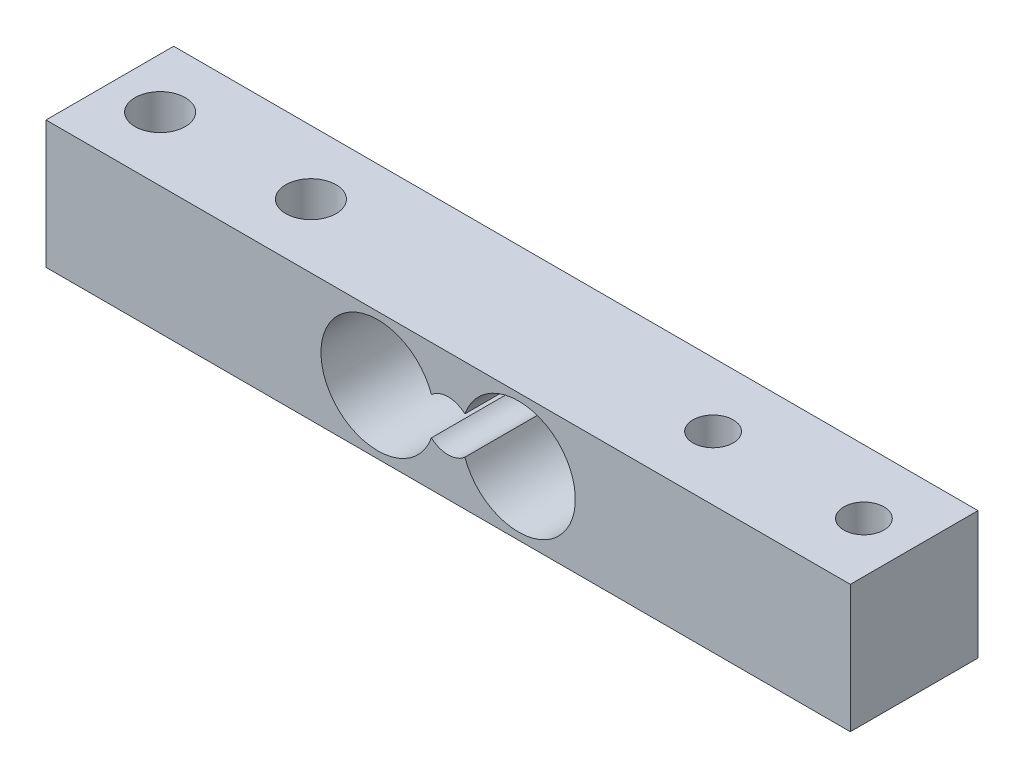
ISO-10303-21;
HEADER;
FILE_DESCRIPTION(('STEP AP214'),'2;1');
FILE_NAME('part.step','',(''),(''),'','','');
FILE_SCHEMA(('AUTOMOTIVE_DESIGN { 1 0 10303 214 1 1 1 1 }'));
ENDSEC;
DATA;
#1=APPLICATION_CONTEXT('core data for automotive mechanical design processes');
#2=APPLICATION_PROTOCOL_DEFINITION('international standard','automotive_design',2000,#1);
#3=PRODUCT_CONTEXT('',#1,'mechanical');
#4=PRODUCT('Part','Part','',(#3));
#5=PRODUCT_RELATED_PRODUCT_CATEGORY('part','',(#4));
#6=PRODUCT_DEFINITION_FORMATION('','',#4);
#7=PRODUCT_DEFINITION_CONTEXT('part definition',#1,'design');
#8=PRODUCT_DEFINITION('design','',#6,#7);
#9=PRODUCT_DEFINITION_SHAPE('','',#8);
#10=(LENGTH_UNIT() NAMED_UNIT(*) SI_UNIT(.MILLI.,.METRE.));
#11=(NAMED_UNIT(*) PLANE_ANGLE_UNIT() SI_UNIT($,.RADIAN.));
#12=(NAMED_UNIT(*) SI_UNIT($,.STERADIAN.) SOLID_ANGLE_UNIT());
#13=UNCERTAINTY_MEASURE_WITH_UNIT(LENGTH_MEASURE(1.E-05),#10,'distance_accuracy_value','');
#14=(GEOMETRIC_REPRESENTATION_CONTEXT(3) GLOBAL_UNCERTAINTY_ASSIGNED_CONTEXT((#13)) GLOBAL_UNIT_ASSIGNED_CONTEXT((#10,
#11,#12)) REPRESENTATION_CONTEXT('',''));
#15=CARTESIAN_POINT('',(0.,0.,0.));
#16=DIRECTION('',(0.,0.,1.));
#17=DIRECTION('',(1.,0.,0.));
#18=AXIS2_PLACEMENT_3D('',#15,#16,#17);
#19=CARTESIAN_POINT('',(0.,12.7,0.));
#20=DIRECTION('',(0.,-1.,0.));
#21=DIRECTION('',(0.,0.,-1.));
#22=AXIS2_PLACEMENT_3D('',#19,#20,#21);
#23=PLANE('',#22);
#24=DIRECTION('',(0.,0.,-1.));
#25=VECTOR('',#24,1.);
#26=CARTESIAN_POINT('',(40.,12.7,6.35));
#27=LINE('',#26,#25);
#28=CARTESIAN_POINT('',(40.,12.7,6.35));
#29=VERTEX_POINT('',#28);
#30=CARTESIAN_POINT('',(40.,12.7,-6.35));
#31=VERTEX_POINT('',#30);
#32=EDGE_CURVE('E158',#29,#31,#27,.T.);
#33=ORIENTED_EDGE('',*,*,#32,.T.);
#34=DIRECTION('',(-1.,0.,0.));
#35=VECTOR('',#34,1.);
#36=CARTESIAN_POINT('',(-40.,12.7,-6.35));
#37=LINE('',#36,#35);
#38=CARTESIAN_POINT('',(-40.,12.7,-6.35));
#39=VERTEX_POINT('',#38);
#40=EDGE_CURVE('E161',#31,#39,#37,.T.);
#41=ORIENTED_EDGE('',*,*,#40,.T.);
#42=DIRECTION('',(0.,0.,1.));
#43=VECTOR('',#42,1.);
#44=CARTESIAN_POINT('',(-40.,12.7,6.35));
#45=LINE('',#44,#43);
#46=CARTESIAN_POINT('',(-40.,12.7,6.35));
#47=VERTEX_POINT('',#46);
#48=EDGE_CURVE('E164',#39,#47,#45,.T.);
#49=ORIENTED_EDGE('',*,*,#48,.T.);
#50=DIRECTION('',(1.,0.,0.));
#51=VECTOR('',#50,1.);
#52=CARTESIAN_POINT('',(-40.,12.7,6.35));
#53=LINE('',#52,#51);
#54=EDGE_CURVE('E166',#47,#29,#53,.T.);
#55=ORIENTED_EDGE('',*,*,#54,.T.);
#56=EDGE_LOOP('',(#33,#41,#49,#55));
#57=FACE_BOUND('',#56,.T.);
#58=CARTESIAN_POINT('',(-35.,12.7,0.));
#59=DIRECTION('',(0.,1.,0.));
#60=DIRECTION('',(0.,0.,1.));
#61=AXIS2_PLACEMENT_3D('',#58,#59,#60);
#62=CIRCLE('',#61,2.5);
#63=CARTESIAN_POINT('',(-35.,12.7,2.5));
#64=VERTEX_POINT('',#63);
#65=EDGE_CURVE('E152',#64,#64,#62,.T.);
#66=ORIENTED_EDGE('',*,*,#65,.F.);
#67=EDGE_LOOP('',(#66));
#68=FACE_BOUND('',#67,.T.);
#69=CARTESIAN_POINT('',(-20.,12.7,0.));
#70=DIRECTION('',(0.,1.,0.));
#71=DIRECTION('',(0.,0.,1.));
#72=AXIS2_PLACEMENT_3D('',#69,#70,#71);
#73=CIRCLE('',#72,2.5);
#74=CARTESIAN_POINT('',(-20.,12.7,2.5));
#75=VERTEX_POINT('',#74);
#76=EDGE_CURVE('E146',#75,#75,#73,.T.);
#77=ORIENTED_EDGE('',*,*,#76,.F.);
#78=EDGE_LOOP('',(#77));
#79=FACE_BOUND('',#78,.T.);
#80=CARTESIAN_POINT('',(20.,12.7,0.));
#81=DIRECTION('',(0.,1.,0.));
#82=DIRECTION('',(0.,0.,1.));
#83=AXIS2_PLACEMENT_3D('',#80,#81,#82);
#84=CIRCLE('',#83,2.);
#85=CARTESIAN_POINT('',(20.,12.7,2.));
#86=VERTEX_POINT('',#85);
#87=EDGE_CURVE('E140',#86,#86,#84,.T.);
#88=ORIENTED_EDGE('',*,*,#87,.F.);
#89=EDGE_LOOP('',(#88));
#90=FACE_BOUND('',#89,.T.);
#91=CARTESIAN_POINT('',(35.,12.7,0.));
#92=DIRECTION('',(0.,1.,0.));
#93=DIRECTION('',(0.,0.,1.));
#94=AXIS2_PLACEMENT_3D('',#91,#92,#93);
#95=CIRCLE('',#94,2.);
#96=CARTESIAN_POINT('',(35.,12.7,2.));
#97=VERTEX_POINT('',#96);
#98=EDGE_CURVE('E134',#97,#97,#95,.T.);
#99=ORIENTED_EDGE('',*,*,#98,.F.);
#100=EDGE_LOOP('',(#99));
#101=FACE_BOUND('',#100,.T.);
#102=ADVANCED_FACE('F32',(#57,#68,#79,#90,#101),#23,.F.);
#103=CARTESIAN_POINT('',(0.,0.,0.));
#104=DIRECTION('',(0.,-1.,0.));
#105=DIRECTION('',(0.,0.,-1.));
#106=AXIS2_PLACEMENT_3D('',#103,#104,#105);
#107=PLANE('',#106);
#108=CARTESIAN_POINT('',(20.,0.,0.));
#109=DIRECTION('',(0.,1.,0.));
#110=DIRECTION('',(0.,0.,1.));
#111=AXIS2_PLACEMENT_3D('',#108,#109,#110);
#112=CIRCLE('',#111,2.);
#113=CARTESIAN_POINT('',(20.,0.,2.));
#114=VERTEX_POINT('',#113);
#115=EDGE_CURVE('E137',#114,#114,#112,.T.);
#116=ORIENTED_EDGE('',*,*,#115,.T.);
#117=EDGE_LOOP('',(#116));
#118=FACE_BOUND('',#117,.T.);
#119=CARTESIAN_POINT('',(-35.,0.,0.));
#120=DIRECTION('',(0.,1.,0.));
#121=DIRECTION('',(0.,0.,1.));
#122=AXIS2_PLACEMENT_3D('',#119,#120,#121);
#123=CIRCLE('',#122,2.5);
#124=CARTESIAN_POINT('',(-35.,0.,2.5));
#125=VERTEX_POINT('',#124);
#126=EDGE_CURVE('E149',#125,#125,#123,.T.);
#127=ORIENTED_EDGE('',*,*,#126,.T.);
#128=EDGE_LOOP('',(#127));
#129=FACE_BOUND('',#128,.T.);
#130=DIRECTION('',(0.,0.,-1.));
#131=VECTOR('',#130,1.);
#132=CARTESIAN_POINT('',(40.,0.,6.35));
#133=LINE('',#132,#131);
#134=CARTESIAN_POINT('',(40.,0.,6.35));
#135=VERTEX_POINT('',#134);
#136=CARTESIAN_POINT('',(40.,0.,-6.35));
#137=VERTEX_POINT('',#136);
#138=EDGE_CURVE('E155',#135,#137,#133,.T.);
#139=ORIENTED_EDGE('',*,*,#138,.F.);
#140=DIRECTION('',(1.,0.,0.));
#141=VECTOR('',#140,1.);
#142=CARTESIAN_POINT('',(-40.,0.,6.35));
#143=LINE('',#142,#141);
#144=CARTESIAN_POINT('',(-40.,0.,6.35));
#145=VERTEX_POINT('',#144);
#146=EDGE_CURVE('E162',#145,#135,#143,.T.);
#147=ORIENTED_EDGE('',*,*,#146,.F.);
#148=DIRECTION('',(0.,0.,1.));
#149=VECTOR('',#148,1.);
#150=CARTESIAN_POINT('',(-40.,0.,6.35));
#151=LINE('',#150,#149);
#152=CARTESIAN_POINT('',(-40.,0.,-6.35));
#153=VERTEX_POINT('',#152);
#154=EDGE_CURVE('E173',#153,#145,#151,.T.);
#155=ORIENTED_EDGE('',*,*,#154,.F.);
#156=DIRECTION('',(-1.,0.,0.));
#157=VECTOR('',#156,1.);
#158=CARTESIAN_POINT('',(-40.,0.,-6.35));
#159=LINE('',#158,#157);
#160=EDGE_CURVE('E171',#137,#153,#159,.T.);
#161=ORIENTED_EDGE('',*,*,#160,.F.);
#162=EDGE_LOOP('',(#139,#147,#155,#161));
#163=FACE_BOUND('',#162,.T.);
#164=CARTESIAN_POINT('',(-20.,0.,0.));
#165=DIRECTION('',(0.,1.,0.));
#166=DIRECTION('',(0.,0.,1.));
#167=AXIS2_PLACEMENT_3D('',#164,#165,#166);
#168=CIRCLE('',#167,2.5);
#169=CARTESIAN_POINT('',(-20.,0.,2.5));
#170=VERTEX_POINT('',#169);
#171=EDGE_CURVE('E143',#170,#170,#168,.T.);
#172=ORIENTED_EDGE('',*,*,#171,.T.);
#173=EDGE_LOOP('',(#172));
#174=FACE_BOUND('',#173,.T.);
#175=CARTESIAN_POINT('',(35.,0.,0.));
#176=DIRECTION('',(0.,1.,0.));
#177=DIRECTION('',(0.,0.,1.));
#178=AXIS2_PLACEMENT_3D('',#175,#176,#177);
#179=CIRCLE('',#178,2.);
#180=CARTESIAN_POINT('',(35.,0.,2.));
#181=VERTEX_POINT('',#180);
#182=EDGE_CURVE('E130',#181,#181,#179,.T.);
#183=ORIENTED_EDGE('',*,*,#182,.T.);
#184=EDGE_LOOP('',(#183));
#185=FACE_BOUND('',#184,.T.);
#186=ADVANCED_FACE('F190',(#118,#129,#163,#174,#185),#107,.T.);
#187=CARTESIAN_POINT('',(40.,12.7,6.35));
#188=DIRECTION('',(-1.,0.,0.));
#189=DIRECTION('',(0.,0.,1.));
#190=AXIS2_PLACEMENT_3D('',#187,#188,#189);
#191=PLANE('',#190);
#192=ORIENTED_EDGE('',*,*,#138,.T.);
#193=DIRECTION('',(0.,-1.,0.));
#194=VECTOR('',#193,1.);
#195=CARTESIAN_POINT('',(40.,12.7,-6.35));
#196=LINE('',#195,#194);
#197=EDGE_CURVE('E11',#31,#137,#196,.T.);
#198=ORIENTED_EDGE('',*,*,#197,.F.);
#199=ORIENTED_EDGE('',*,*,#32,.F.);
#200=DIRECTION('',(0.,-1.,0.));
#201=VECTOR('',#200,1.);
#202=CARTESIAN_POINT('',(40.,12.7,6.35));
#203=LINE('',#202,#201);
#204=EDGE_CURVE('E168',#29,#135,#203,.T.);
#205=ORIENTED_EDGE('',*,*,#204,.T.);
#206=EDGE_LOOP('',(#192,#198,#199,#205));
#207=FACE_BOUND('',#206,.T.);
#208=ADVANCED_FACE('F34',(#207),#191,.F.);
#209=CARTESIAN_POINT('',(-40.,12.7,-6.35));
#210=DIRECTION('',(0.,0.,1.));
#211=DIRECTION('',(1.,0.,0.));
#212=AXIS2_PLACEMENT_3D('',#209,#210,#211);
#213=PLANE('',#212);
#214=CARTESIAN_POINT('',(-7.,6.35,-6.35));
#215=DIRECTION('',(0.,0.,1.));
#216=DIRECTION('',(1.,0.,0.));
#217=AXIS2_PLACEMENT_3D('',#214,#215,#216);
#218=CIRCLE('',#217,5.65);
#219=CARTESIAN_POINT('',(-1.66625,8.21376257541029,-6.35));
#220=VERTEX_POINT('',#219);
#221=CARTESIAN_POINT('',(-1.66625,4.4862374245897,-6.35));
#222=VERTEX_POINT('',#221);
#223=EDGE_CURVE('E105',#220,#222,#218,.T.);
#224=ORIENTED_EDGE('',*,*,#223,.T.);
#225=CARTESIAN_POINT('',(0.,6.35,-6.35));
#226=DIRECTION('',(0.,0.,1.));
#227=DIRECTION('',(1.,0.,0.));
#228=AXIS2_PLACEMENT_3D('',#225,#226,#227);
#229=CIRCLE('',#228,2.5);
#230=CARTESIAN_POINT('',(1.66625,4.48623742458971,-6.35));
#231=VERTEX_POINT('',#230);
#232=EDGE_CURVE('E99',#222,#231,#229,.T.);
#233=ORIENTED_EDGE('',*,*,#232,.T.);
#234=CARTESIAN_POINT('',(7.,6.35,-6.35));
#235=DIRECTION('',(0.,0.,1.));
#236=DIRECTION('',(1.,0.,0.));
#237=AXIS2_PLACEMENT_3D('',#234,#235,#236);
#238=CIRCLE('',#237,5.65);
#239=CARTESIAN_POINT('',(1.66625,8.21376257541029,-6.35));
#240=VERTEX_POINT('',#239);
#241=EDGE_CURVE('E108',#231,#240,#238,.T.);
#242=ORIENTED_EDGE('',*,*,#241,.T.);
#243=CARTESIAN_POINT('',(0.,6.35,-6.35));
#244=DIRECTION('',(0.,0.,1.));
#245=DIRECTION('',(1.,0.,0.));
#246=AXIS2_PLACEMENT_3D('',#243,#244,#245);
#247=CIRCLE('',#246,2.5);
#248=EDGE_CURVE('E47',#240,#220,#247,.T.);
#249=ORIENTED_EDGE('',*,*,#248,.T.);
#250=EDGE_LOOP('',(#224,#233,#242,#249));
#251=FACE_BOUND('',#250,.T.);
#252=ORIENTED_EDGE('',*,*,#160,.T.);
#253=DIRECTION('',(0.,-1.,0.));
#254=VECTOR('',#253,1.);
#255=CARTESIAN_POINT('',(-40.,12.7,-6.35));
#256=LINE('',#255,#254);
#257=EDGE_CURVE('E40',#39,#153,#256,.T.);
#258=ORIENTED_EDGE('',*,*,#257,.F.);
#259=ORIENTED_EDGE('',*,*,#40,.F.);
#260=ORIENTED_EDGE('',*,*,#197,.T.);
#261=EDGE_LOOP('',(#252,#258,#259,#260));
#262=FACE_BOUND('',#261,.T.);
#263=ADVANCED_FACE('F112',(#251,#262),#213,.F.);
#264=CARTESIAN_POINT('',(-40.,12.7,6.35));
#265=DIRECTION('',(1.,0.,0.));
#266=DIRECTION('',(0.,0.,-1.));
#267=AXIS2_PLACEMENT_3D('',#264,#265,#266);
#268=PLANE('',#267);
#269=ORIENTED_EDGE('',*,*,#154,.T.);
#270=DIRECTION('',(0.,-1.,0.));
#271=VECTOR('',#270,1.);
#272=CARTESIAN_POINT('',(-40.,12.7,6.35));
#273=LINE('',#272,#271);
#274=EDGE_CURVE('E178',#47,#145,#273,.T.);
#275=ORIENTED_EDGE('',*,*,#274,.F.);
#276=ORIENTED_EDGE('',*,*,#48,.F.);
#277=ORIENTED_EDGE('',*,*,#257,.T.);
#278=EDGE_LOOP('',(#269,#275,#276,#277));
#279=FACE_BOUND('',#278,.T.);
#280=ADVANCED_FACE('F185',(#279),#268,.F.);
#281=CARTESIAN_POINT('',(-40.,12.7,6.35));
#282=DIRECTION('',(0.,0.,-1.));
#283=DIRECTION('',(-1.,0.,0.));
#284=AXIS2_PLACEMENT_3D('',#281,#282,#283);
#285=PLANE('',#284);
#286=CARTESIAN_POINT('',(7.,6.35,6.35));
#287=DIRECTION('',(0.,0.,1.));
#288=DIRECTION('',(1.,0.,0.));
#289=AXIS2_PLACEMENT_3D('',#286,#287,#288);
#290=CIRCLE('',#289,5.65);
#291=CARTESIAN_POINT('',(1.66625,4.48623742458971,6.35));
#292=VERTEX_POINT('',#291);
#293=CARTESIAN_POINT('',(1.66625,8.21376257541029,6.35));
#294=VERTEX_POINT('',#293);
#295=EDGE_CURVE('E124',#292,#294,#290,.T.);
#296=ORIENTED_EDGE('',*,*,#295,.F.);
#297=CARTESIAN_POINT('',(0.,6.35,6.35));
#298=DIRECTION('',(0.,0.,1.));
#299=DIRECTION('',(1.,0.,0.));
#300=AXIS2_PLACEMENT_3D('',#297,#298,#299);
#301=CIRCLE('',#300,2.5);
#302=CARTESIAN_POINT('',(-1.66625,4.4862374245897,6.35));
#303=VERTEX_POINT('',#302);
#304=EDGE_CURVE('E55',#303,#292,#301,.T.);
#305=ORIENTED_EDGE('',*,*,#304,.F.);
#306=CARTESIAN_POINT('',(-7.,6.35,6.35));
#307=DIRECTION('',(0.,0.,1.));
#308=DIRECTION('',(1.,0.,0.));
#309=AXIS2_PLACEMENT_3D('',#306,#307,#308);
#310=CIRCLE('',#309,5.65);
#311=CARTESIAN_POINT('',(-1.66625,8.21376257541029,6.35));
#312=VERTEX_POINT('',#311);
#313=EDGE_CURVE('E115',#312,#303,#310,.T.);
#314=ORIENTED_EDGE('',*,*,#313,.F.);
#315=CARTESIAN_POINT('',(0.,6.35,6.35));
#316=DIRECTION('',(0.,0.,1.));
#317=DIRECTION('',(1.,0.,0.));
#318=AXIS2_PLACEMENT_3D('',#315,#316,#317);
#319=CIRCLE('',#318,2.5);
#320=EDGE_CURVE('E118',#294,#312,#319,.T.);
#321=ORIENTED_EDGE('',*,*,#320,.F.);
#322=EDGE_LOOP('',(#296,#305,#314,#321));
#323=FACE_BOUND('',#322,.T.);
#324=ORIENTED_EDGE('',*,*,#146,.T.);
#325=ORIENTED_EDGE('',*,*,#204,.F.);
#326=ORIENTED_EDGE('',*,*,#54,.F.);
#327=ORIENTED_EDGE('',*,*,#274,.T.);
#328=EDGE_LOOP('',(#324,#325,#326,#327));
#329=FACE_BOUND('',#328,.T.);
#330=ADVANCED_FACE('F194',(#323,#329),#285,.F.);
#331=CARTESIAN_POINT('',(-35.,12.7,0.));
#332=DIRECTION('',(0.,-1.,0.));
#333=DIRECTION('',(0.,0.,-1.));
#334=AXIS2_PLACEMENT_3D('',#331,#332,#333);
#335=CYLINDRICAL_SURFACE('',#334,2.5);
#336=ORIENTED_EDGE('',*,*,#65,.T.);
#337=EDGE_LOOP('',(#336));
#338=FACE_BOUND('',#337,.T.);
#339=ORIENTED_EDGE('',*,*,#126,.F.);
#340=EDGE_LOOP('',(#339));
#341=FACE_BOUND('',#340,.T.);
#342=ADVANCED_FACE('F215',(#338,#341),#335,.F.);
#343=CARTESIAN_POINT('',(-20.,12.7,0.));
#344=DIRECTION('',(0.,-1.,0.));
#345=DIRECTION('',(0.,0.,-1.));
#346=AXIS2_PLACEMENT_3D('',#343,#344,#345);
#347=CYLINDRICAL_SURFACE('',#346,2.5);
#348=ORIENTED_EDGE('',*,*,#76,.T.);
#349=EDGE_LOOP('',(#348));
#350=FACE_BOUND('',#349,.T.);
#351=ORIENTED_EDGE('',*,*,#171,.F.);
#352=EDGE_LOOP('',(#351));
#353=FACE_BOUND('',#352,.T.);
#354=ADVANCED_FACE('F223',(#350,#353),#347,.F.);
#355=CARTESIAN_POINT('',(20.,12.7,0.));
#356=DIRECTION('',(0.,-1.,0.));
#357=DIRECTION('',(0.,0.,-1.));
#358=AXIS2_PLACEMENT_3D('',#355,#356,#357);
#359=CYLINDRICAL_SURFACE('',#358,2.);
#360=ORIENTED_EDGE('',*,*,#87,.T.);
#361=EDGE_LOOP('',(#360));
#362=FACE_BOUND('',#361,.T.);
#363=ORIENTED_EDGE('',*,*,#115,.F.);
#364=EDGE_LOOP('',(#363));
#365=FACE_BOUND('',#364,.T.);
#366=ADVANCED_FACE('F244',(#362,#365),#359,.F.);
#367=CARTESIAN_POINT('',(35.,12.7,0.));
#368=DIRECTION('',(0.,-1.,0.));
#369=DIRECTION('',(0.,0.,-1.));
#370=AXIS2_PLACEMENT_3D('',#367,#368,#369);
#371=CYLINDRICAL_SURFACE('',#370,2.);
#372=ORIENTED_EDGE('',*,*,#98,.T.);
#373=EDGE_LOOP('',(#372));
#374=FACE_BOUND('',#373,.T.);
#375=ORIENTED_EDGE('',*,*,#182,.F.);
#376=EDGE_LOOP('',(#375));
#377=FACE_BOUND('',#376,.T.);
#378=ADVANCED_FACE('F237',(#374,#377),#371,.F.);
#379=CARTESIAN_POINT('',(0.,6.35,-6.35));
#380=DIRECTION('',(0.,0.,1.));
#381=DIRECTION('',(1.,0.,0.));
#382=AXIS2_PLACEMENT_3D('',#379,#380,#381);
#383=CYLINDRICAL_SURFACE('',#382,2.5);
#384=ORIENTED_EDGE('',*,*,#304,.T.);
#385=DIRECTION('',(0.,0.,1.));
#386=VECTOR('',#385,1.);
#387=CARTESIAN_POINT('',(1.66625,4.48623742458971,-6.35));
#388=LINE('',#387,#386);
#389=EDGE_CURVE('E95',#231,#292,#388,.T.);
#390=ORIENTED_EDGE('',*,*,#389,.F.);
#391=ORIENTED_EDGE('',*,*,#232,.F.);
#392=DIRECTION('',(0.,0.,1.));
#393=VECTOR('',#392,1.);
#394=CARTESIAN_POINT('',(-1.66625,4.4862374245897,-6.35));
#395=LINE('',#394,#393);
#396=EDGE_CURVE('E128',#222,#303,#395,.T.);
#397=ORIENTED_EDGE('',*,*,#396,.T.);
#398=EDGE_LOOP('',(#384,#390,#391,#397));
#399=FACE_BOUND('',#398,.T.);
#400=ADVANCED_FACE('F97',(#399),#383,.F.);
#401=CARTESIAN_POINT('',(-7.,6.35,-6.35));
#402=DIRECTION('',(0.,0.,1.));
#403=DIRECTION('',(1.,0.,0.));
#404=AXIS2_PLACEMENT_3D('',#401,#402,#403);
#405=CYLINDRICAL_SURFACE('',#404,5.65);
#406=ORIENTED_EDGE('',*,*,#313,.T.);
#407=ORIENTED_EDGE('',*,*,#396,.F.);
#408=ORIENTED_EDGE('',*,*,#223,.F.);
#409=DIRECTION('',(0.,0.,1.));
#410=VECTOR('',#409,1.);
#411=CARTESIAN_POINT('',(-1.66625,8.21376257541029,-6.35));
#412=LINE('',#411,#410);
#413=EDGE_CURVE('E131',#220,#312,#412,.T.);
#414=ORIENTED_EDGE('',*,*,#413,.T.);
#415=EDGE_LOOP('',(#406,#407,#408,#414));
#416=FACE_BOUND('',#415,.T.);
#417=ADVANCED_FACE('F229',(#416),#405,.F.);
#418=CARTESIAN_POINT('',(0.,6.35,-6.35));
#419=DIRECTION('',(0.,0.,1.));
#420=DIRECTION('',(1.,0.,0.));
#421=AXIS2_PLACEMENT_3D('',#418,#419,#420);
#422=CYLINDRICAL_SURFACE('',#421,2.5);
#423=ORIENTED_EDGE('',*,*,#320,.T.);
#424=ORIENTED_EDGE('',*,*,#413,.F.);
#425=ORIENTED_EDGE('',*,*,#248,.F.);
#426=DIRECTION('',(0.,0.,1.));
#427=VECTOR('',#426,1.);
#428=CARTESIAN_POINT('',(1.66625,8.21376257541029,-6.35));
#429=LINE('',#428,#427);
#430=EDGE_CURVE('E104',#240,#294,#429,.T.);
#431=ORIENTED_EDGE('',*,*,#430,.T.);
#432=EDGE_LOOP('',(#423,#424,#425,#431));
#433=FACE_BOUND('',#432,.T.);
#434=ADVANCED_FACE('F227',(#433),#422,.F.);
#435=CARTESIAN_POINT('',(7.,6.35,-6.35));
#436=DIRECTION('',(0.,0.,1.));
#437=DIRECTION('',(1.,0.,0.));
#438=AXIS2_PLACEMENT_3D('',#435,#436,#437);
#439=CYLINDRICAL_SURFACE('',#438,5.65);
#440=ORIENTED_EDGE('',*,*,#295,.T.);
#441=ORIENTED_EDGE('',*,*,#430,.F.);
#442=ORIENTED_EDGE('',*,*,#241,.F.);
#443=ORIENTED_EDGE('',*,*,#389,.T.);
#444=EDGE_LOOP('',(#440,#441,#442,#443));
#445=FACE_BOUND('',#444,.T.);
#446=ADVANCED_FACE('F109',(#445),#439,.F.);
#447=CLOSED_SHELL('',(#102,#186,#208,#263,#280,#330,#342,#354,#366,#378,#400,#417,#434,#446));
#448=MANIFOLD_SOLID_BREP('B2',#447);
#449=ADVANCED_BREP_SHAPE_REPRESENTATION('',(#18,#448),#14);
#450=SHAPE_DEFINITION_REPRESENTATION(#9,#449);
ENDSEC;
END-ISO-10303-21;
